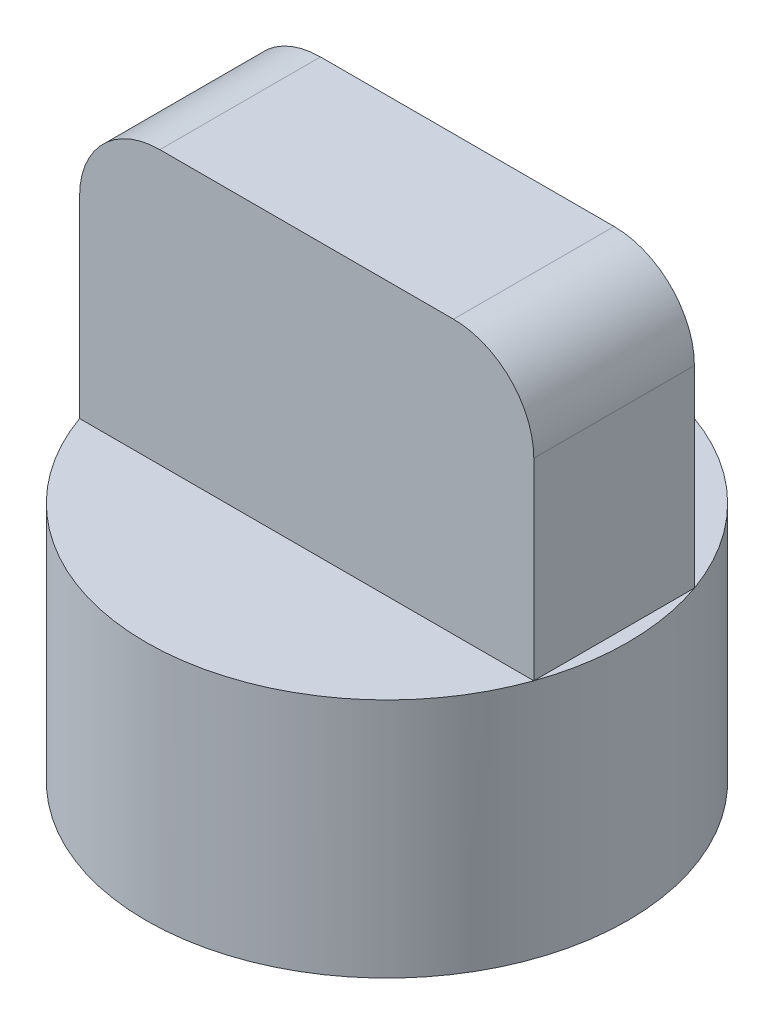
ISO-10303-21;
HEADER;
FILE_DESCRIPTION(('STEP AP214'),'2;1');
FILE_NAME('part.step','',(''),(''),'','','');
FILE_SCHEMA(('AUTOMOTIVE_DESIGN { 1 0 10303 214 1 1 1 1 }'));
ENDSEC;
DATA;
#1=APPLICATION_CONTEXT('core data for automotive mechanical design processes');
#2=APPLICATION_PROTOCOL_DEFINITION('international standard','automotive_design',2000,#1);
#3=PRODUCT_CONTEXT('',#1,'mechanical');
#4=PRODUCT('Part','Part','',(#3));
#5=PRODUCT_RELATED_PRODUCT_CATEGORY('part','',(#4));
#6=PRODUCT_DEFINITION_FORMATION('','',#4);
#7=PRODUCT_DEFINITION_CONTEXT('part definition',#1,'design');
#8=PRODUCT_DEFINITION('design','',#6,#7);
#9=PRODUCT_DEFINITION_SHAPE('','',#8);
#10=(LENGTH_UNIT() NAMED_UNIT(*) SI_UNIT(.MILLI.,.METRE.));
#11=(NAMED_UNIT(*) PLANE_ANGLE_UNIT() SI_UNIT($,.RADIAN.));
#12=(NAMED_UNIT(*) SI_UNIT($,.STERADIAN.) SOLID_ANGLE_UNIT());
#13=UNCERTAINTY_MEASURE_WITH_UNIT(LENGTH_MEASURE(1.E-05),#10,'distance_accuracy_value','');
#14=(GEOMETRIC_REPRESENTATION_CONTEXT(3) GLOBAL_UNCERTAINTY_ASSIGNED_CONTEXT((#13)) GLOBAL_UNIT_ASSIGNED_CONTEXT((#10,
#11,#12)) REPRESENTATION_CONTEXT('',''));
#15=CARTESIAN_POINT('',(0.,0.,0.));
#16=DIRECTION('',(0.,0.,1.));
#17=DIRECTION('',(1.,0.,0.));
#18=AXIS2_PLACEMENT_3D('',#15,#16,#17);
#19=CARTESIAN_POINT('',(0.,0.,0.));
#20=DIRECTION('',(0.,1.,0.));
#21=DIRECTION('',(0.,0.,1.));
#22=AXIS2_PLACEMENT_3D('',#19,#20,#21);
#23=PLANE('',#22);
#24=DIRECTION('',(0.,0.,1.));
#25=VECTOR('',#24,1.);
#26=CARTESIAN_POINT('',(-14.142135623731,0.,-5.));
#27=LINE('',#26,#25);
#28=CARTESIAN_POINT('',(-14.142135623731,0.,-5.));
#29=VERTEX_POINT('',#28);
#30=CARTESIAN_POINT('',(-14.142135623731,0.,5.));
#31=VERTEX_POINT('',#30);
#32=EDGE_CURVE('E148',#29,#31,#27,.T.);
#33=ORIENTED_EDGE('',*,*,#32,.F.);
#34=CARTESIAN_POINT('',(0.,0.,0.));
#35=DIRECTION('',(0.,1.,0.));
#36=DIRECTION('',(0.,0.,1.));
#37=AXIS2_PLACEMENT_3D('',#34,#35,#36);
#38=CIRCLE('',#37,15.);
#39=EDGE_CURVE('E141',#29,#31,#38,.T.);
#40=ORIENTED_EDGE('',*,*,#39,.T.);
#41=EDGE_LOOP('',(#33,#40));
#42=FACE_BOUND('',#41,.T.);
#43=ADVANCED_FACE('F56',(#42),#23,.T.);
#44=DIRECTION('',(-1.,0.,0.));
#45=VECTOR('',#44,1.);
#46=CARTESIAN_POINT('',(-14.142135623731,0.,-5.));
#47=LINE('',#46,#45);
#48=CARTESIAN_POINT('',(14.142135623731,0.,-4.99999999999999));
#49=VERTEX_POINT('',#48);
#50=EDGE_CURVE('E144',#49,#29,#47,.T.);
#51=ORIENTED_EDGE('',*,*,#50,.F.);
#52=EDGE_CURVE('E131',#49,#29,#38,.T.);
#53=ORIENTED_EDGE('',*,*,#52,.T.);
#54=EDGE_LOOP('',(#51,#53));
#55=FACE_BOUND('',#54,.T.);
#56=ADVANCED_FACE('F208',(#55),#23,.T.);
#57=DIRECTION('',(0.,0.,-1.));
#58=VECTOR('',#57,1.);
#59=CARTESIAN_POINT('',(14.142135623731,0.,-5.));
#60=LINE('',#59,#58);
#61=CARTESIAN_POINT('',(14.142135623731,0.,5.));
#62=VERTEX_POINT('',#61);
#63=EDGE_CURVE('E112',#62,#49,#60,.T.);
#64=ORIENTED_EDGE('',*,*,#63,.F.);
#65=EDGE_CURVE('E123',#62,#49,#38,.T.);
#66=ORIENTED_EDGE('',*,*,#65,.T.);
#67=EDGE_LOOP('',(#64,#66));
#68=FACE_BOUND('',#67,.T.);
#69=ADVANCED_FACE('F142',(#68),#23,.T.);
#70=CARTESIAN_POINT('',(0.,-15.,0.));
#71=DIRECTION('',(0.,1.,0.));
#72=DIRECTION('',(0.,0.,1.));
#73=AXIS2_PLACEMENT_3D('',#70,#71,#72);
#74=CYLINDRICAL_SURFACE('',#73,15.);
#75=ORIENTED_EDGE('',*,*,#65,.F.);
#76=EDGE_CURVE('E128',#31,#62,#38,.T.);
#77=ORIENTED_EDGE('',*,*,#76,.F.);
#78=ORIENTED_EDGE('',*,*,#39,.F.);
#79=ORIENTED_EDGE('',*,*,#52,.F.);
#80=EDGE_LOOP('',(#75,#77,#78,#79));
#81=FACE_BOUND('',#80,.T.);
#82=CARTESIAN_POINT('',(0.,-15.,0.));
#83=DIRECTION('',(0.,1.,0.));
#84=DIRECTION('',(0.,0.,1.));
#85=AXIS2_PLACEMENT_3D('',#82,#83,#84);
#86=CIRCLE('',#85,15.);
#87=CARTESIAN_POINT('',(0.,-15.,15.));
#88=VERTEX_POINT('',#87);
#89=EDGE_CURVE('E134',#88,#88,#86,.T.);
#90=ORIENTED_EDGE('',*,*,#89,.T.);
#91=EDGE_LOOP('',(#90));
#92=FACE_BOUND('',#91,.T.);
#93=ADVANCED_FACE('F125',(#81,#92),#74,.T.);
#94=DIRECTION('',(1.,0.,0.));
#95=VECTOR('',#94,1.);
#96=CARTESIAN_POINT('',(-14.142135623731,0.,5.));
#97=LINE('',#96,#95);
#98=EDGE_CURVE('E139',#31,#62,#97,.T.);
#99=ORIENTED_EDGE('',*,*,#98,.F.);
#100=ORIENTED_EDGE('',*,*,#76,.T.);
#101=EDGE_LOOP('',(#99,#100));
#102=FACE_BOUND('',#101,.T.);
#103=ADVANCED_FACE('F138',(#102),#23,.T.);
#104=CARTESIAN_POINT('',(0.,-15.,0.));
#105=DIRECTION('',(0.,1.,0.));
#106=DIRECTION('',(0.,0.,1.));
#107=AXIS2_PLACEMENT_3D('',#104,#105,#106);
#108=PLANE('',#107);
#109=ORIENTED_EDGE('',*,*,#89,.F.);
#110=EDGE_LOOP('',(#109));
#111=FACE_BOUND('',#110,.T.);
#112=ADVANCED_FACE('F223',(#111),#108,.F.);
#113=CARTESIAN_POINT('',(-14.142135623731,17.,-5.));
#114=DIRECTION('',(1.,0.,0.));
#115=DIRECTION('',(0.,0.,-1.));
#116=AXIS2_PLACEMENT_3D('',#113,#114,#115);
#117=PLANE('',#116);
#118=DIRECTION('',(0.,-1.,0.));
#119=VECTOR('',#118,1.);
#120=CARTESIAN_POINT('',(-14.142135623731,17.,5.));
#121=LINE('',#120,#119);
#122=CARTESIAN_POINT('',(-14.142135623731,12.,5.));
#123=VERTEX_POINT('',#122);
#124=EDGE_CURVE('E116',#123,#31,#121,.T.);
#125=ORIENTED_EDGE('',*,*,#124,.F.);
#126=DIRECTION('',(0.,0.,1.));
#127=VECTOR('',#126,1.);
#128=CARTESIAN_POINT('',(-14.142135623731,12.,-5.));
#129=LINE('',#128,#127);
#130=CARTESIAN_POINT('',(-14.142135623731,12.,-5.));
#131=VERTEX_POINT('',#130);
#132=EDGE_CURVE('E12',#123,#131,#129,.F.);
#133=ORIENTED_EDGE('',*,*,#132,.T.);
#134=DIRECTION('',(0.,-1.,0.));
#135=VECTOR('',#134,1.);
#136=CARTESIAN_POINT('',(-14.142135623731,17.,-5.));
#137=LINE('',#136,#135);
#138=EDGE_CURVE('E159',#131,#29,#137,.T.);
#139=ORIENTED_EDGE('',*,*,#138,.T.);
#140=ORIENTED_EDGE('',*,*,#32,.T.);
#141=EDGE_LOOP('',(#125,#133,#139,#140));
#142=FACE_BOUND('',#141,.T.);
#143=ADVANCED_FACE('F213',(#142),#117,.F.);
#144=CARTESIAN_POINT('',(-14.142135623731,17.,5.));
#145=DIRECTION('',(0.,0.,-1.));
#146=DIRECTION('',(-1.,0.,0.));
#147=AXIS2_PLACEMENT_3D('',#144,#145,#146);
#148=PLANE('',#147);
#149=DIRECTION('',(0.,-1.,0.));
#150=VECTOR('',#149,1.);
#151=CARTESIAN_POINT('',(14.142135623731,17.,5.));
#152=LINE('',#151,#150);
#153=CARTESIAN_POINT('',(14.142135623731,12.,5.));
#154=VERTEX_POINT('',#153);
#155=EDGE_CURVE('E108',#154,#62,#152,.T.);
#156=ORIENTED_EDGE('',*,*,#155,.F.);
#157=CARTESIAN_POINT('',(9.14213562373095,12.,5.));
#158=DIRECTION('',(0.,0.,-1.));
#159=DIRECTION('',(-1.,0.,0.));
#160=AXIS2_PLACEMENT_3D('',#157,#158,#159);
#161=CIRCLE('',#160,5.);
#162=CARTESIAN_POINT('',(9.14213562373095,17.,5.));
#163=VERTEX_POINT('',#162);
#164=EDGE_CURVE('E65',#154,#163,#161,.F.);
#165=ORIENTED_EDGE('',*,*,#164,.T.);
#166=DIRECTION('',(1.,0.,0.));
#167=VECTOR('',#166,1.);
#168=CARTESIAN_POINT('',(-14.142135623731,17.,5.));
#169=LINE('',#168,#167);
#170=CARTESIAN_POINT('',(-9.14213562373095,17.,5.));
#171=VERTEX_POINT('',#170);
#172=EDGE_CURVE('E158',#171,#163,#169,.T.);
#173=ORIENTED_EDGE('',*,*,#172,.F.);
#174=CARTESIAN_POINT('',(-9.14213562373095,12.,5.));
#175=DIRECTION('',(0.,0.,-1.));
#176=DIRECTION('',(-1.,0.,0.));
#177=AXIS2_PLACEMENT_3D('',#174,#175,#176);
#178=CIRCLE('',#177,5.);
#179=EDGE_CURVE('E72',#171,#123,#178,.F.);
#180=ORIENTED_EDGE('',*,*,#179,.T.);
#181=ORIENTED_EDGE('',*,*,#124,.T.);
#182=ORIENTED_EDGE('',*,*,#98,.T.);
#183=EDGE_LOOP('',(#156,#165,#173,#180,#181,#182));
#184=FACE_BOUND('',#183,.T.);
#185=ADVANCED_FACE('F146',(#184),#148,.F.);
#186=CARTESIAN_POINT('',(14.142135623731,17.,-5.));
#187=DIRECTION('',(-1.,0.,0.));
#188=DIRECTION('',(0.,0.,1.));
#189=AXIS2_PLACEMENT_3D('',#186,#187,#188);
#190=PLANE('',#189);
#191=DIRECTION('',(0.,-1.,0.));
#192=VECTOR('',#191,1.);
#193=CARTESIAN_POINT('',(14.142135623731,17.,-5.));
#194=LINE('',#193,#192);
#195=CARTESIAN_POINT('',(14.142135623731,12.,-5.));
#196=VERTEX_POINT('',#195);
#197=EDGE_CURVE('E117',#196,#49,#194,.T.);
#198=ORIENTED_EDGE('',*,*,#197,.F.);
#199=DIRECTION('',(0.,0.,-1.));
#200=VECTOR('',#199,1.);
#201=CARTESIAN_POINT('',(14.142135623731,12.,5.));
#202=LINE('',#201,#200);
#203=EDGE_CURVE('E80',#196,#154,#202,.F.);
#204=ORIENTED_EDGE('',*,*,#203,.T.);
#205=ORIENTED_EDGE('',*,*,#155,.T.);
#206=ORIENTED_EDGE('',*,*,#63,.T.);
#207=EDGE_LOOP('',(#198,#204,#205,#206));
#208=FACE_BOUND('',#207,.T.);
#209=ADVANCED_FACE('F110',(#208),#190,.F.);
#210=CARTESIAN_POINT('',(-14.142135623731,17.,-5.));
#211=DIRECTION('',(0.,0.,1.));
#212=DIRECTION('',(1.,0.,0.));
#213=AXIS2_PLACEMENT_3D('',#210,#211,#212);
#214=PLANE('',#213);
#215=DIRECTION('',(-1.,0.,0.));
#216=VECTOR('',#215,1.);
#217=CARTESIAN_POINT('',(-14.142135623731,17.,-5.));
#218=LINE('',#217,#216);
#219=CARTESIAN_POINT('',(9.14213562373095,17.,-5.));
#220=VERTEX_POINT('',#219);
#221=CARTESIAN_POINT('',(-9.14213562373095,17.,-5.));
#222=VERTEX_POINT('',#221);
#223=EDGE_CURVE('E162',#220,#222,#218,.T.);
#224=ORIENTED_EDGE('',*,*,#223,.F.);
#225=CARTESIAN_POINT('',(9.14213562373095,12.,-5.));
#226=DIRECTION('',(0.,0.,1.));
#227=DIRECTION('',(1.,0.,0.));
#228=AXIS2_PLACEMENT_3D('',#225,#226,#227);
#229=CIRCLE('',#228,5.);
#230=EDGE_CURVE('E181',#220,#196,#229,.F.);
#231=ORIENTED_EDGE('',*,*,#230,.T.);
#232=ORIENTED_EDGE('',*,*,#197,.T.);
#233=ORIENTED_EDGE('',*,*,#50,.T.);
#234=ORIENTED_EDGE('',*,*,#138,.F.);
#235=CARTESIAN_POINT('',(-9.14213562373095,12.,-5.));
#236=DIRECTION('',(0.,0.,1.));
#237=DIRECTION('',(1.,0.,0.));
#238=AXIS2_PLACEMENT_3D('',#235,#236,#237);
#239=CIRCLE('',#238,5.);
#240=EDGE_CURVE('E178',#131,#222,#239,.F.);
#241=ORIENTED_EDGE('',*,*,#240,.T.);
#242=EDGE_LOOP('',(#224,#231,#232,#233,#234,#241));
#243=FACE_BOUND('',#242,.T.);
#244=ADVANCED_FACE('F200',(#243),#214,.F.);
#245=CARTESIAN_POINT('',(0.,17.,0.));
#246=DIRECTION('',(0.,1.,0.));
#247=DIRECTION('',(0.,0.,1.));
#248=AXIS2_PLACEMENT_3D('',#245,#246,#247);
#249=PLANE('',#248);
#250=ORIENTED_EDGE('',*,*,#172,.T.);
#251=DIRECTION('',(0.,0.,-1.));
#252=VECTOR('',#251,1.);
#253=CARTESIAN_POINT('',(9.14213562373095,17.,-5.));
#254=LINE('',#253,#252);
#255=EDGE_CURVE('E174',#163,#220,#254,.T.);
#256=ORIENTED_EDGE('',*,*,#255,.T.);
#257=ORIENTED_EDGE('',*,*,#223,.T.);
#258=DIRECTION('',(0.,0.,1.));
#259=VECTOR('',#258,1.);
#260=CARTESIAN_POINT('',(-9.14213562373095,17.,5.));
#261=LINE('',#260,#259);
#262=EDGE_CURVE('E169',#222,#171,#261,.T.);
#263=ORIENTED_EDGE('',*,*,#262,.T.);
#264=EDGE_LOOP('',(#250,#256,#257,#263));
#265=FACE_BOUND('',#264,.T.);
#266=ADVANCED_FACE('F192',(#265),#249,.T.);
#267=CARTESIAN_POINT('',(9.14213562373095,12.,0.));
#268=DIRECTION('',(0.,0.,1.));
#269=DIRECTION('',(1.,0.,0.));
#270=AXIS2_PLACEMENT_3D('',#267,#268,#269);
#271=CYLINDRICAL_SURFACE('',#270,5.);
#272=ORIENTED_EDGE('',*,*,#164,.F.);
#273=ORIENTED_EDGE('',*,*,#203,.F.);
#274=ORIENTED_EDGE('',*,*,#230,.F.);
#275=ORIENTED_EDGE('',*,*,#255,.F.);
#276=EDGE_LOOP('',(#272,#273,#274,#275));
#277=FACE_BOUND('',#276,.T.);
#278=ADVANCED_FACE('F198',(#277),#271,.T.);
#279=CARTESIAN_POINT('',(-9.14213562373095,12.,0.));
#280=DIRECTION('',(0.,0.,-1.));
#281=DIRECTION('',(-1.,0.,0.));
#282=AXIS2_PLACEMENT_3D('',#279,#280,#281);
#283=CYLINDRICAL_SURFACE('',#282,5.);
#284=ORIENTED_EDGE('',*,*,#240,.F.);
#285=ORIENTED_EDGE('',*,*,#132,.F.);
#286=ORIENTED_EDGE('',*,*,#179,.F.);
#287=ORIENTED_EDGE('',*,*,#262,.F.);
#288=EDGE_LOOP('',(#284,#285,#286,#287));
#289=FACE_BOUND('',#288,.T.);
#290=ADVANCED_FACE('F58',(#289),#283,.T.);
#291=CLOSED_SHELL('',(#43,#56,#69,#93,#103,#112,#143,#185,#209,#244,#266,#278,#290));
#292=MANIFOLD_SOLID_BREP('B2',#291);
#293=ADVANCED_BREP_SHAPE_REPRESENTATION('',(#18,#292),#14);
#294=SHAPE_DEFINITION_REPRESENTATION(#9,#293);
ENDSEC;
END-ISO-10303-21;
